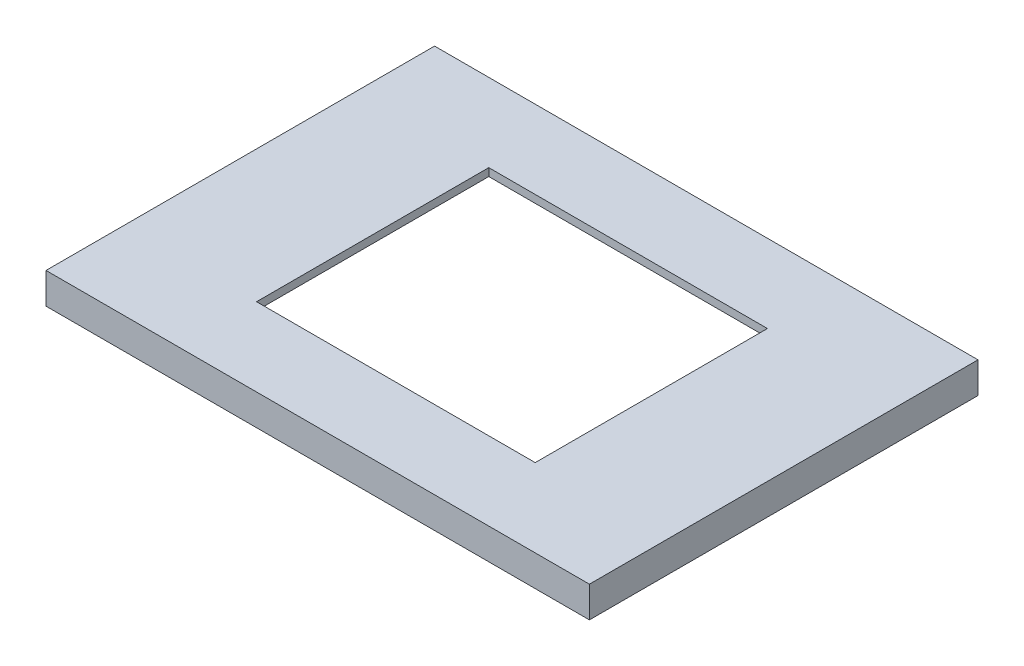
ISO-10303-21;
HEADER;
FILE_DESCRIPTION(('STEP AP214'),'2;1');
FILE_NAME('part.step','',(''),(''),'','','');
FILE_SCHEMA(('AUTOMOTIVE_DESIGN { 1 0 10303 214 1 1 1 1 }'));
ENDSEC;
DATA;
#1=APPLICATION_CONTEXT('core data for automotive mechanical design processes');
#2=APPLICATION_PROTOCOL_DEFINITION('international standard','automotive_design',2000,#1);
#3=PRODUCT_CONTEXT('',#1,'mechanical');
#4=PRODUCT('Part','Part','',(#3));
#5=PRODUCT_RELATED_PRODUCT_CATEGORY('part','',(#4));
#6=PRODUCT_DEFINITION_FORMATION('','',#4);
#7=PRODUCT_DEFINITION_CONTEXT('part definition',#1,'design');
#8=PRODUCT_DEFINITION('design','',#6,#7);
#9=PRODUCT_DEFINITION_SHAPE('','',#8);
#10=(LENGTH_UNIT() NAMED_UNIT(*) SI_UNIT(.MILLI.,.METRE.));
#11=(NAMED_UNIT(*) PLANE_ANGLE_UNIT() SI_UNIT($,.RADIAN.));
#12=(NAMED_UNIT(*) SI_UNIT($,.STERADIAN.) SOLID_ANGLE_UNIT());
#13=UNCERTAINTY_MEASURE_WITH_UNIT(LENGTH_MEASURE(1.E-05),#10,'distance_accuracy_value','');
#14=(GEOMETRIC_REPRESENTATION_CONTEXT(3) GLOBAL_UNCERTAINTY_ASSIGNED_CONTEXT((#13)) GLOBAL_UNIT_ASSIGNED_CONTEXT((#10,
#11,#12)) REPRESENTATION_CONTEXT('',''));
#15=CARTESIAN_POINT('',(0.,0.,0.));
#16=DIRECTION('',(0.,0.,1.));
#17=DIRECTION('',(1.,0.,0.));
#18=AXIS2_PLACEMENT_3D('',#15,#16,#17);
#19=CARTESIAN_POINT('',(-33.1,1.25,23.1));
#20=DIRECTION('',(1.,0.,0.));
#21=DIRECTION('',(0.,0.,-1.));
#22=AXIS2_PLACEMENT_3D('',#19,#20,#21);
#23=PLANE('',#22);
#24=DIRECTION('',(0.,-1.,0.));
#25=VECTOR('',#24,1.);
#26=CARTESIAN_POINT('',(-33.1,1.25,-23.1));
#27=LINE('',#26,#25);
#28=CARTESIAN_POINT('',(-33.1,-1.44160797830996,-23.1));
#29=VERTEX_POINT('',#28);
#30=CARTESIAN_POINT('',(-33.1,-1.75,-23.1));
#31=VERTEX_POINT('',#30);
#32=EDGE_CURVE('E197',#29,#31,#27,.T.);
#33=ORIENTED_EDGE('',*,*,#32,.F.);
#34=DIRECTION('',(0.,0.,1.));
#35=VECTOR('',#34,1.);
#36=CARTESIAN_POINT('',(-33.1,-1.44160797830996,23.1));
#37=LINE('',#36,#35);
#38=CARTESIAN_POINT('',(-33.1,-1.44160797830996,23.1));
#39=VERTEX_POINT('',#38);
#40=EDGE_CURVE('E374',#29,#39,#37,.T.);
#41=ORIENTED_EDGE('',*,*,#40,.T.);
#42=DIRECTION('',(0.,-1.,0.));
#43=VECTOR('',#42,1.);
#44=CARTESIAN_POINT('',(-33.1,1.25,23.1));
#45=LINE('',#44,#43);
#46=CARTESIAN_POINT('',(-33.1,-1.75,23.1));
#47=VERTEX_POINT('',#46);
#48=EDGE_CURVE('E214',#39,#47,#45,.T.);
#49=ORIENTED_EDGE('',*,*,#48,.T.);
#50=DIRECTION('',(0.,0.,-1.));
#51=VECTOR('',#50,1.);
#52=CARTESIAN_POINT('',(-33.1,-1.75,23.1));
#53=LINE('',#52,#51);
#54=EDGE_CURVE('E212',#47,#31,#53,.T.);
#55=ORIENTED_EDGE('',*,*,#54,.T.);
#56=EDGE_LOOP('',(#33,#41,#49,#55));
#57=FACE_BOUND('',#56,.T.);
#58=ADVANCED_FACE('F57',(#57),#23,.T.);
#59=CARTESIAN_POINT('',(33.1,1.25,23.1));
#60=DIRECTION('',(0.,0.,-1.));
#61=DIRECTION('',(-1.,0.,0.));
#62=AXIS2_PLACEMENT_3D('',#59,#60,#61);
#63=PLANE('',#62);
#64=ORIENTED_EDGE('',*,*,#48,.F.);
#65=DIRECTION('',(1.,0.,0.));
#66=VECTOR('',#65,1.);
#67=CARTESIAN_POINT('',(33.1,-1.44160797830996,23.1));
#68=LINE('',#67,#66);
#69=CARTESIAN_POINT('',(33.1,-1.44160797830996,23.1));
#70=VERTEX_POINT('',#69);
#71=EDGE_CURVE('E370',#39,#70,#68,.T.);
#72=ORIENTED_EDGE('',*,*,#71,.T.);
#73=DIRECTION('',(0.,-1.,0.));
#74=VECTOR('',#73,1.);
#75=CARTESIAN_POINT('',(33.1,1.25,23.1));
#76=LINE('',#75,#74);
#77=CARTESIAN_POINT('',(33.1,-1.75,23.1));
#78=VERTEX_POINT('',#77);
#79=EDGE_CURVE('E328',#70,#78,#76,.T.);
#80=ORIENTED_EDGE('',*,*,#79,.T.);
#81=DIRECTION('',(-1.,0.,0.));
#82=VECTOR('',#81,1.);
#83=CARTESIAN_POINT('',(-33.1,-1.75,23.1));
#84=LINE('',#83,#82);
#85=EDGE_CURVE('E227',#78,#47,#84,.T.);
#86=ORIENTED_EDGE('',*,*,#85,.T.);
#87=EDGE_LOOP('',(#64,#72,#80,#86));
#88=FACE_BOUND('',#87,.T.);
#89=ADVANCED_FACE('F435',(#88),#63,.T.);
#90=CARTESIAN_POINT('',(33.1,1.25,23.1));
#91=DIRECTION('',(-1.,0.,0.));
#92=DIRECTION('',(0.,0.,1.));
#93=AXIS2_PLACEMENT_3D('',#90,#91,#92);
#94=PLANE('',#93);
#95=ORIENTED_EDGE('',*,*,#79,.F.);
#96=DIRECTION('',(0.,0.,-1.));
#97=VECTOR('',#96,1.);
#98=CARTESIAN_POINT('',(33.1,-1.44160797830996,-23.1));
#99=LINE('',#98,#97);
#100=CARTESIAN_POINT('',(33.1,-1.44160797830996,-23.1));
#101=VERTEX_POINT('',#100);
#102=EDGE_CURVE('E12',#70,#101,#99,.T.);
#103=ORIENTED_EDGE('',*,*,#102,.T.);
#104=DIRECTION('',(0.,-1.,0.));
#105=VECTOR('',#104,1.);
#106=CARTESIAN_POINT('',(33.1,1.25,-23.1));
#107=LINE('',#106,#105);
#108=CARTESIAN_POINT('',(33.1,-1.75,-23.1));
#109=VERTEX_POINT('',#108);
#110=EDGE_CURVE('E324',#101,#109,#107,.T.);
#111=ORIENTED_EDGE('',*,*,#110,.T.);
#112=DIRECTION('',(0.,0.,1.));
#113=VECTOR('',#112,1.);
#114=CARTESIAN_POINT('',(33.1,-1.75,23.1));
#115=LINE('',#114,#113);
#116=EDGE_CURVE('E223',#109,#78,#115,.T.);
#117=ORIENTED_EDGE('',*,*,#116,.T.);
#118=EDGE_LOOP('',(#95,#103,#111,#117));
#119=FACE_BOUND('',#118,.T.);
#120=ADVANCED_FACE('F499',(#119),#94,.T.);
#121=CARTESIAN_POINT('',(33.1,1.25,-23.1));
#122=DIRECTION('',(0.,0.,1.));
#123=DIRECTION('',(1.,0.,0.));
#124=AXIS2_PLACEMENT_3D('',#121,#122,#123);
#125=PLANE('',#124);
#126=ORIENTED_EDGE('',*,*,#110,.F.);
#127=DIRECTION('',(-1.,0.,0.));
#128=VECTOR('',#127,1.);
#129=CARTESIAN_POINT('',(-33.1,-1.44160797830996,-23.1));
#130=LINE('',#129,#128);
#131=EDGE_CURVE('E204',#101,#29,#130,.T.);
#132=ORIENTED_EDGE('',*,*,#131,.T.);
#133=ORIENTED_EDGE('',*,*,#32,.T.);
#134=DIRECTION('',(1.,0.,0.));
#135=VECTOR('',#134,1.);
#136=CARTESIAN_POINT('',(-33.1,-1.75,-23.1));
#137=LINE('',#136,#135);
#138=EDGE_CURVE('E201',#31,#109,#137,.T.);
#139=ORIENTED_EDGE('',*,*,#138,.T.);
#140=EDGE_LOOP('',(#126,#132,#133,#139));
#141=FACE_BOUND('',#140,.T.);
#142=ADVANCED_FACE('F199',(#141),#125,.T.);
#143=CARTESIAN_POINT('',(35.1,1.25,25.1));
#144=DIRECTION('',(0.,0.,-1.));
#145=DIRECTION('',(-1.,0.,0.));
#146=AXIS2_PLACEMENT_3D('',#143,#144,#145);
#147=PLANE('',#146);
#148=DIRECTION('',(0.,-1.,0.));
#149=VECTOR('',#148,1.);
#150=CARTESIAN_POINT('',(-35.1,1.25,25.1));
#151=LINE('',#150,#149);
#152=CARTESIAN_POINT('',(-35.1,2.25,25.1));
#153=VERTEX_POINT('',#152);
#154=CARTESIAN_POINT('',(-35.1,-1.75,25.1));
#155=VERTEX_POINT('',#154);
#156=EDGE_CURVE('E337',#153,#155,#151,.T.);
#157=ORIENTED_EDGE('',*,*,#156,.T.);
#158=DIRECTION('',(-1.,0.,0.));
#159=VECTOR('',#158,1.);
#160=CARTESIAN_POINT('',(-35.1,-1.75,25.1));
#161=LINE('',#160,#159);
#162=CARTESIAN_POINT('',(35.1,-1.75,25.1));
#163=VERTEX_POINT('',#162);
#164=EDGE_CURVE('E245',#163,#155,#161,.T.);
#165=ORIENTED_EDGE('',*,*,#164,.F.);
#166=DIRECTION('',(0.,-1.,0.));
#167=VECTOR('',#166,1.);
#168=CARTESIAN_POINT('',(35.1,1.25,25.1));
#169=LINE('',#168,#167);
#170=CARTESIAN_POINT('',(35.1,2.25,25.1));
#171=VERTEX_POINT('',#170);
#172=EDGE_CURVE('E346',#171,#163,#169,.T.);
#173=ORIENTED_EDGE('',*,*,#172,.F.);
#174=DIRECTION('',(1.,0.,0.));
#175=VECTOR('',#174,1.);
#176=CARTESIAN_POINT('',(35.1,2.25,25.1));
#177=LINE('',#176,#175);
#178=EDGE_CURVE('E296',#153,#171,#177,.T.);
#179=ORIENTED_EDGE('',*,*,#178,.F.);
#180=EDGE_LOOP('',(#157,#165,#173,#179));
#181=FACE_BOUND('',#180,.T.);
#182=ADVANCED_FACE('F532',(#181),#147,.F.);
#183=CARTESIAN_POINT('',(35.1,1.25,25.1));
#184=DIRECTION('',(-1.,0.,0.));
#185=DIRECTION('',(0.,0.,1.));
#186=AXIS2_PLACEMENT_3D('',#183,#184,#185);
#187=PLANE('',#186);
#188=ORIENTED_EDGE('',*,*,#172,.T.);
#189=DIRECTION('',(0.,0.,1.));
#190=VECTOR('',#189,1.);
#191=CARTESIAN_POINT('',(35.1,-1.75,25.1));
#192=LINE('',#191,#190);
#193=CARTESIAN_POINT('',(35.1,-1.75,-25.1));
#194=VERTEX_POINT('',#193);
#195=EDGE_CURVE('E241',#194,#163,#192,.T.);
#196=ORIENTED_EDGE('',*,*,#195,.F.);
#197=DIRECTION('',(0.,-1.,0.));
#198=VECTOR('',#197,1.);
#199=CARTESIAN_POINT('',(35.1,1.25,-25.1));
#200=LINE('',#199,#198);
#201=CARTESIAN_POINT('',(35.1,2.25,-25.1));
#202=VERTEX_POINT('',#201);
#203=EDGE_CURVE('E343',#202,#194,#200,.T.);
#204=ORIENTED_EDGE('',*,*,#203,.F.);
#205=DIRECTION('',(0.,0.,-1.));
#206=VECTOR('',#205,1.);
#207=CARTESIAN_POINT('',(35.1,2.25,25.1));
#208=LINE('',#207,#206);
#209=EDGE_CURVE('E300',#171,#202,#208,.T.);
#210=ORIENTED_EDGE('',*,*,#209,.F.);
#211=EDGE_LOOP('',(#188,#196,#204,#210));
#212=FACE_BOUND('',#211,.T.);
#213=ADVANCED_FACE('F526',(#212),#187,.F.);
#214=CARTESIAN_POINT('',(35.1,1.25,-25.1));
#215=DIRECTION('',(0.,0.,1.));
#216=DIRECTION('',(1.,0.,0.));
#217=AXIS2_PLACEMENT_3D('',#214,#215,#216);
#218=PLANE('',#217);
#219=ORIENTED_EDGE('',*,*,#203,.T.);
#220=DIRECTION('',(1.,0.,0.));
#221=VECTOR('',#220,1.);
#222=CARTESIAN_POINT('',(-35.1,-1.75,-25.1));
#223=LINE('',#222,#221);
#224=CARTESIAN_POINT('',(-35.1,-1.75,-25.1));
#225=VERTEX_POINT('',#224);
#226=EDGE_CURVE('E237',#225,#194,#223,.T.);
#227=ORIENTED_EDGE('',*,*,#226,.F.);
#228=DIRECTION('',(0.,-1.,0.));
#229=VECTOR('',#228,1.);
#230=CARTESIAN_POINT('',(-35.1,1.25,-25.1));
#231=LINE('',#230,#229);
#232=CARTESIAN_POINT('',(-35.1,2.25,-25.1));
#233=VERTEX_POINT('',#232);
#234=EDGE_CURVE('E340',#233,#225,#231,.T.);
#235=ORIENTED_EDGE('',*,*,#234,.F.);
#236=DIRECTION('',(-1.,0.,0.));
#237=VECTOR('',#236,1.);
#238=CARTESIAN_POINT('',(35.1,2.25,-25.1));
#239=LINE('',#238,#237);
#240=EDGE_CURVE('E304',#202,#233,#239,.T.);
#241=ORIENTED_EDGE('',*,*,#240,.F.);
#242=EDGE_LOOP('',(#219,#227,#235,#241));
#243=FACE_BOUND('',#242,.T.);
#244=ADVANCED_FACE('F521',(#243),#218,.F.);
#245=CARTESIAN_POINT('',(-35.1,1.25,25.1));
#246=DIRECTION('',(1.,0.,0.));
#247=DIRECTION('',(0.,0.,-1.));
#248=AXIS2_PLACEMENT_3D('',#245,#246,#247);
#249=PLANE('',#248);
#250=ORIENTED_EDGE('',*,*,#234,.T.);
#251=DIRECTION('',(0.,0.,-1.));
#252=VECTOR('',#251,1.);
#253=CARTESIAN_POINT('',(-35.1,-1.75,25.1));
#254=LINE('',#253,#252);
#255=EDGE_CURVE('E233',#155,#225,#254,.T.);
#256=ORIENTED_EDGE('',*,*,#255,.F.);
#257=ORIENTED_EDGE('',*,*,#156,.F.);
#258=DIRECTION('',(0.,0.,1.));
#259=VECTOR('',#258,1.);
#260=CARTESIAN_POINT('',(-35.1,2.25,25.1));
#261=LINE('',#260,#259);
#262=EDGE_CURVE('E292',#233,#153,#261,.T.);
#263=ORIENTED_EDGE('',*,*,#262,.F.);
#264=EDGE_LOOP('',(#250,#256,#257,#263));
#265=FACE_BOUND('',#264,.T.);
#266=ADVANCED_FACE('F516',(#265),#249,.F.);
#267=CARTESIAN_POINT('',(-33.1,1.25,23.1));
#268=VERTEX_POINT('',#267);
#269=CARTESIAN_POINT('',(-33.1,-0.258392021690037,23.1));
#270=VERTEX_POINT('',#269);
#271=EDGE_CURVE('E333',#268,#270,#45,.T.);
#272=ORIENTED_EDGE('',*,*,#271,.T.);
#273=DIRECTION('',(0.,0.,1.));
#274=VECTOR('',#273,1.);
#275=CARTESIAN_POINT('',(-33.1,-0.258392021690041,-23.1));
#276=LINE('',#275,#274);
#277=CARTESIAN_POINT('',(-33.1,-0.258392021690037,-23.1));
#278=VERTEX_POINT('',#277);
#279=EDGE_CURVE('E356',#270,#278,#276,.F.);
#280=ORIENTED_EDGE('',*,*,#279,.T.);
#281=CARTESIAN_POINT('',(-33.1,1.25,-23.1));
#282=VERTEX_POINT('',#281);
#283=EDGE_CURVE('E208',#282,#278,#27,.T.);
#284=ORIENTED_EDGE('',*,*,#283,.F.);
#285=DIRECTION('',(0.,0.,1.));
#286=VECTOR('',#285,1.);
#287=CARTESIAN_POINT('',(-33.1,1.25,23.1));
#288=LINE('',#287,#286);
#289=EDGE_CURVE('E308',#282,#268,#288,.T.);
#290=ORIENTED_EDGE('',*,*,#289,.T.);
#291=EDGE_LOOP('',(#272,#280,#284,#290));
#292=FACE_BOUND('',#291,.T.);
#293=ADVANCED_FACE('F489',(#292),#23,.T.);
#294=CARTESIAN_POINT('',(33.1,1.25,23.1));
#295=VERTEX_POINT('',#294);
#296=CARTESIAN_POINT('',(33.1,-0.258392021690038,23.1));
#297=VERTEX_POINT('',#296);
#298=EDGE_CURVE('E329',#295,#297,#76,.T.);
#299=ORIENTED_EDGE('',*,*,#298,.T.);
#300=DIRECTION('',(1.,0.,0.));
#301=VECTOR('',#300,1.);
#302=CARTESIAN_POINT('',(-33.1,-0.258392021690037,23.1));
#303=LINE('',#302,#301);
#304=EDGE_CURVE('E367',#297,#270,#303,.F.);
#305=ORIENTED_EDGE('',*,*,#304,.T.);
#306=ORIENTED_EDGE('',*,*,#271,.F.);
#307=DIRECTION('',(1.,0.,0.));
#308=VECTOR('',#307,1.);
#309=CARTESIAN_POINT('',(33.1,1.25,23.1));
#310=LINE('',#309,#308);
#311=EDGE_CURVE('E312',#268,#295,#310,.T.);
#312=ORIENTED_EDGE('',*,*,#311,.T.);
#313=EDGE_LOOP('',(#299,#305,#306,#312));
#314=FACE_BOUND('',#313,.T.);
#315=ADVANCED_FACE('F486',(#314),#63,.T.);
#316=CARTESIAN_POINT('',(33.1,1.25,-23.1));
#317=VERTEX_POINT('',#316);
#318=CARTESIAN_POINT('',(33.1,-0.258392021690037,-23.1));
#319=VERTEX_POINT('',#318);
#320=EDGE_CURVE('E325',#317,#319,#107,.T.);
#321=ORIENTED_EDGE('',*,*,#320,.T.);
#322=DIRECTION('',(0.,0.,-1.));
#323=VECTOR('',#322,1.);
#324=CARTESIAN_POINT('',(33.1,-0.258392021690038,23.1));
#325=LINE('',#324,#323);
#326=EDGE_CURVE('E391',#319,#297,#325,.F.);
#327=ORIENTED_EDGE('',*,*,#326,.T.);
#328=ORIENTED_EDGE('',*,*,#298,.F.);
#329=DIRECTION('',(0.,0.,-1.));
#330=VECTOR('',#329,1.);
#331=CARTESIAN_POINT('',(33.1,1.25,23.1));
#332=LINE('',#331,#330);
#333=EDGE_CURVE('E316',#295,#317,#332,.T.);
#334=ORIENTED_EDGE('',*,*,#333,.T.);
#335=EDGE_LOOP('',(#321,#327,#328,#334));
#336=FACE_BOUND('',#335,.T.);
#337=ADVANCED_FACE('F496',(#336),#94,.T.);
#338=ORIENTED_EDGE('',*,*,#283,.T.);
#339=DIRECTION('',(-1.,0.,0.));
#340=VECTOR('',#339,1.);
#341=CARTESIAN_POINT('',(33.1,-0.258392021690037,-23.1));
#342=LINE('',#341,#340);
#343=EDGE_CURVE('E67',#278,#319,#342,.F.);
#344=ORIENTED_EDGE('',*,*,#343,.T.);
#345=ORIENTED_EDGE('',*,*,#320,.F.);
#346=DIRECTION('',(-1.,0.,0.));
#347=VECTOR('',#346,1.);
#348=CARTESIAN_POINT('',(33.1,1.25,-23.1));
#349=LINE('',#348,#347);
#350=EDGE_CURVE('E209',#317,#282,#349,.T.);
#351=ORIENTED_EDGE('',*,*,#350,.T.);
#352=EDGE_LOOP('',(#338,#344,#345,#351));
#353=FACE_BOUND('',#352,.T.);
#354=ADVANCED_FACE('F494',(#353),#125,.T.);
#355=CARTESIAN_POINT('',(0.,2.25,0.));
#356=DIRECTION('',(0.,1.,0.));
#357=DIRECTION('',(0.,0.,1.));
#358=AXIS2_PLACEMENT_3D('',#355,#356,#357);
#359=PLANE('',#358);
#360=ORIENTED_EDGE('',*,*,#262,.T.);
#361=ORIENTED_EDGE('',*,*,#178,.T.);
#362=ORIENTED_EDGE('',*,*,#209,.T.);
#363=ORIENTED_EDGE('',*,*,#240,.T.);
#364=EDGE_LOOP('',(#360,#361,#362,#363));
#365=FACE_BOUND('',#364,.T.);
#366=DIRECTION('',(-1.,0.,0.));
#367=VECTOR('',#366,1.);
#368=CARTESIAN_POINT('',(-18.,2.25,-15.));
#369=LINE('',#368,#367);
#370=CARTESIAN_POINT('',(18.,2.25,-15.));
#371=VERTEX_POINT('',#370);
#372=CARTESIAN_POINT('',(-18.,2.25,-15.));
#373=VERTEX_POINT('',#372);
#374=EDGE_CURVE('E253',#371,#373,#369,.T.);
#375=ORIENTED_EDGE('',*,*,#374,.F.);
#376=DIRECTION('',(0.,0.,-1.));
#377=VECTOR('',#376,1.);
#378=CARTESIAN_POINT('',(18.,2.25,15.));
#379=LINE('',#378,#377);
#380=CARTESIAN_POINT('',(18.,2.25,15.));
#381=VERTEX_POINT('',#380);
#382=EDGE_CURVE('E250',#381,#371,#379,.T.);
#383=ORIENTED_EDGE('',*,*,#382,.F.);
#384=DIRECTION('',(1.,0.,0.));
#385=VECTOR('',#384,1.);
#386=CARTESIAN_POINT('',(-18.,2.25,15.));
#387=LINE('',#386,#385);
#388=CARTESIAN_POINT('',(-18.,2.25,15.));
#389=VERTEX_POINT('',#388);
#390=EDGE_CURVE('E261',#389,#381,#387,.T.);
#391=ORIENTED_EDGE('',*,*,#390,.F.);
#392=DIRECTION('',(0.,0.,1.));
#393=VECTOR('',#392,1.);
#394=CARTESIAN_POINT('',(-18.,2.25,15.));
#395=LINE('',#394,#393);
#396=EDGE_CURVE('E257',#373,#389,#395,.T.);
#397=ORIENTED_EDGE('',*,*,#396,.F.);
#398=EDGE_LOOP('',(#375,#383,#391,#397));
#399=FACE_BOUND('',#398,.T.);
#400=ADVANCED_FACE('F504',(#365,#399),#359,.T.);
#401=CARTESIAN_POINT('',(0.,1.25,0.));
#402=DIRECTION('',(0.,1.,0.));
#403=DIRECTION('',(0.,0.,1.));
#404=AXIS2_PLACEMENT_3D('',#401,#402,#403);
#405=PLANE('',#404);
#406=ORIENTED_EDGE('',*,*,#289,.F.);
#407=ORIENTED_EDGE('',*,*,#350,.F.);
#408=ORIENTED_EDGE('',*,*,#333,.F.);
#409=ORIENTED_EDGE('',*,*,#311,.F.);
#410=EDGE_LOOP('',(#406,#407,#408,#409));
#411=FACE_BOUND('',#410,.T.);
#412=DIRECTION('',(0.,0.,-1.));
#413=VECTOR('',#412,1.);
#414=CARTESIAN_POINT('',(18.,1.25,15.));
#415=LINE('',#414,#413);
#416=CARTESIAN_POINT('',(18.,1.25,15.));
#417=VERTEX_POINT('',#416);
#418=CARTESIAN_POINT('',(18.,1.25,-15.));
#419=VERTEX_POINT('',#418);
#420=EDGE_CURVE('E249',#417,#419,#415,.T.);
#421=ORIENTED_EDGE('',*,*,#420,.T.);
#422=DIRECTION('',(-1.,0.,0.));
#423=VECTOR('',#422,1.);
#424=CARTESIAN_POINT('',(-18.,1.25,-15.));
#425=LINE('',#424,#423);
#426=CARTESIAN_POINT('',(-18.,1.25,-15.));
#427=VERTEX_POINT('',#426);
#428=EDGE_CURVE('E268',#419,#427,#425,.T.);
#429=ORIENTED_EDGE('',*,*,#428,.T.);
#430=DIRECTION('',(0.,0.,1.));
#431=VECTOR('',#430,1.);
#432=CARTESIAN_POINT('',(-18.,1.25,15.));
#433=LINE('',#432,#431);
#434=CARTESIAN_POINT('',(-18.,1.25,15.));
#435=VERTEX_POINT('',#434);
#436=EDGE_CURVE('E272',#427,#435,#433,.T.);
#437=ORIENTED_EDGE('',*,*,#436,.T.);
#438=DIRECTION('',(1.,0.,0.));
#439=VECTOR('',#438,1.);
#440=CARTESIAN_POINT('',(-18.,1.25,15.));
#441=LINE('',#440,#439);
#442=EDGE_CURVE('E254',#435,#417,#441,.T.);
#443=ORIENTED_EDGE('',*,*,#442,.T.);
#444=EDGE_LOOP('',(#421,#429,#437,#443));
#445=FACE_BOUND('',#444,.T.);
#446=ADVANCED_FACE('F492',(#411,#445),#405,.F.);
#447=CARTESIAN_POINT('',(18.,2.25,15.));
#448=DIRECTION('',(-1.,0.,0.));
#449=DIRECTION('',(0.,0.,1.));
#450=AXIS2_PLACEMENT_3D('',#447,#448,#449);
#451=PLANE('',#450);
#452=ORIENTED_EDGE('',*,*,#420,.F.);
#453=DIRECTION('',(0.,-1.,0.));
#454=VECTOR('',#453,1.);
#455=CARTESIAN_POINT('',(18.,2.25,15.));
#456=LINE('',#455,#454);
#457=EDGE_CURVE('E264',#381,#417,#456,.T.);
#458=ORIENTED_EDGE('',*,*,#457,.F.);
#459=ORIENTED_EDGE('',*,*,#382,.T.);
#460=DIRECTION('',(0.,-1.,0.));
#461=VECTOR('',#460,1.);
#462=CARTESIAN_POINT('',(18.,2.25,-15.));
#463=LINE('',#462,#461);
#464=EDGE_CURVE('E288',#371,#419,#463,.T.);
#465=ORIENTED_EDGE('',*,*,#464,.T.);
#466=EDGE_LOOP('',(#452,#458,#459,#465));
#467=FACE_BOUND('',#466,.T.);
#468=ADVANCED_FACE('F690',(#467),#451,.T.);
#469=CARTESIAN_POINT('',(-18.,2.25,-15.));
#470=DIRECTION('',(0.,0.,1.));
#471=DIRECTION('',(1.,0.,0.));
#472=AXIS2_PLACEMENT_3D('',#469,#470,#471);
#473=PLANE('',#472);
#474=ORIENTED_EDGE('',*,*,#428,.F.);
#475=ORIENTED_EDGE('',*,*,#464,.F.);
#476=ORIENTED_EDGE('',*,*,#374,.T.);
#477=DIRECTION('',(0.,-1.,0.));
#478=VECTOR('',#477,1.);
#479=CARTESIAN_POINT('',(-18.,2.25,-15.));
#480=LINE('',#479,#478);
#481=EDGE_CURVE('E285',#373,#427,#480,.T.);
#482=ORIENTED_EDGE('',*,*,#481,.T.);
#483=EDGE_LOOP('',(#474,#475,#476,#482));
#484=FACE_BOUND('',#483,.T.);
#485=ADVANCED_FACE('F696',(#484),#473,.T.);
#486=CARTESIAN_POINT('',(-18.,2.25,15.));
#487=DIRECTION('',(1.,0.,0.));
#488=DIRECTION('',(0.,0.,-1.));
#489=AXIS2_PLACEMENT_3D('',#486,#487,#488);
#490=PLANE('',#489);
#491=ORIENTED_EDGE('',*,*,#436,.F.);
#492=ORIENTED_EDGE('',*,*,#481,.F.);
#493=ORIENTED_EDGE('',*,*,#396,.T.);
#494=DIRECTION('',(0.,-1.,0.));
#495=VECTOR('',#494,1.);
#496=CARTESIAN_POINT('',(-18.,2.25,15.));
#497=LINE('',#496,#495);
#498=EDGE_CURVE('E282',#389,#435,#497,.T.);
#499=ORIENTED_EDGE('',*,*,#498,.T.);
#500=EDGE_LOOP('',(#491,#492,#493,#499));
#501=FACE_BOUND('',#500,.T.);
#502=ADVANCED_FACE('F700',(#501),#490,.T.);
#503=CARTESIAN_POINT('',(-18.,2.25,15.));
#504=DIRECTION('',(0.,0.,-1.));
#505=DIRECTION('',(-1.,0.,0.));
#506=AXIS2_PLACEMENT_3D('',#503,#504,#505);
#507=PLANE('',#506);
#508=ORIENTED_EDGE('',*,*,#442,.F.);
#509=ORIENTED_EDGE('',*,*,#498,.F.);
#510=ORIENTED_EDGE('',*,*,#390,.T.);
#511=ORIENTED_EDGE('',*,*,#457,.T.);
#512=EDGE_LOOP('',(#508,#509,#510,#511));
#513=FACE_BOUND('',#512,.T.);
#514=ADVANCED_FACE('F624',(#513),#507,.T.);
#515=CARTESIAN_POINT('',(0.,-1.75,0.));
#516=DIRECTION('',(0.,-1.,0.));
#517=DIRECTION('',(0.,0.,-1.));
#518=AXIS2_PLACEMENT_3D('',#515,#516,#517);
#519=PLANE('',#518);
#520=ORIENTED_EDGE('',*,*,#255,.T.);
#521=ORIENTED_EDGE('',*,*,#226,.T.);
#522=ORIENTED_EDGE('',*,*,#195,.T.);
#523=ORIENTED_EDGE('',*,*,#164,.T.);
#524=EDGE_LOOP('',(#520,#521,#522,#523));
#525=FACE_BOUND('',#524,.T.);
#526=ORIENTED_EDGE('',*,*,#138,.F.);
#527=ORIENTED_EDGE('',*,*,#54,.F.);
#528=ORIENTED_EDGE('',*,*,#85,.F.);
#529=ORIENTED_EDGE('',*,*,#116,.F.);
#530=EDGE_LOOP('',(#526,#527,#528,#529));
#531=FACE_BOUND('',#530,.T.);
#532=ADVANCED_FACE('F221',(#525,#531),#519,.T.);
#533=CARTESIAN_POINT('',(33.75,-0.85,23.1));
#534=DIRECTION('',(-1.,0.,0.));
#535=DIRECTION('',(0.,0.,1.));
#536=AXIS2_PLACEMENT_3D('',#533,#534,#535);
#537=CYLINDRICAL_SURFACE('',#536,0.5);
#538=CARTESIAN_POINT('',(-33.1,-0.85,23.1));
#539=DIRECTION('',(-0.707106781186548,0.,-0.707106781186548));
#540=DIRECTION('',(0.707106781186548,0.,-0.707106781186548));
#541=AXIS2_PLACEMENT_3D('',#538,#539,#540);
#542=ELLIPSE('',#541,0.707106781186548,0.5);
#543=CARTESIAN_POINT('',(-33.1833333333333,-0.356993351408365,23.1833333333333));
#544=VERTEX_POINT('',#543);
#545=CARTESIAN_POINT('',(-33.1833333333333,-1.34300664859163,23.1833333333333));
#546=VERTEX_POINT('',#545);
#547=EDGE_CURVE('E410',#544,#546,#542,.F.);
#548=ORIENTED_EDGE('',*,*,#547,.F.);
#549=DIRECTION('',(-1.,0.,0.));
#550=VECTOR('',#549,1.);
#551=CARTESIAN_POINT('',(33.75,-0.356993351408365,23.1833333333333));
#552=LINE('',#551,#550);
#553=CARTESIAN_POINT('',(33.1833333333333,-0.356993351408366,23.1833333333333));
#554=VERTEX_POINT('',#553);
#555=EDGE_CURVE('E364',#544,#554,#552,.F.);
#556=ORIENTED_EDGE('',*,*,#555,.T.);
#557=CARTESIAN_POINT('',(33.1,-0.85,23.1));
#558=DIRECTION('',(-0.707106781186548,0.,0.707106781186547));
#559=DIRECTION('',(0.707106781186547,0.,0.707106781186548));
#560=AXIS2_PLACEMENT_3D('',#557,#558,#559);
#561=ELLIPSE('',#560,0.707106781186548,0.5);
#562=CARTESIAN_POINT('',(33.1833333333333,-1.34300664859163,23.1833333333333));
#563=VERTEX_POINT('',#562);
#564=EDGE_CURVE('E446',#554,#563,#561,.F.);
#565=ORIENTED_EDGE('',*,*,#564,.T.);
#566=DIRECTION('',(-1.,0.,0.));
#567=VECTOR('',#566,1.);
#568=CARTESIAN_POINT('',(33.75,-1.34300664859164,23.1833333333333));
#569=LINE('',#568,#567);
#570=EDGE_CURVE('E360',#563,#546,#569,.T.);
#571=ORIENTED_EDGE('',*,*,#570,.T.);
#572=EDGE_LOOP('',(#548,#556,#565,#571));
#573=FACE_BOUND('',#572,.T.);
#574=ADVANCED_FACE('F444',(#573),#537,.F.);
#575=CARTESIAN_POINT('',(-33.1,-0.85,23.75));
#576=DIRECTION('',(0.,0.,-1.));
#577=DIRECTION('',(-1.,0.,0.));
#578=AXIS2_PLACEMENT_3D('',#575,#576,#577);
#579=CYLINDRICAL_SURFACE('',#578,0.5);
#580=CARTESIAN_POINT('',(-33.1,-0.85,-23.1));
#581=DIRECTION('',(0.707106781186548,0.,-0.707106781186548));
#582=DIRECTION('',(0.707106781186548,0.,0.707106781186548));
#583=AXIS2_PLACEMENT_3D('',#580,#581,#582);
#584=ELLIPSE('',#583,0.707106781186548,0.5);
#585=CARTESIAN_POINT('',(-33.1833333333333,-0.356993351408364,-23.1833333333333));
#586=VERTEX_POINT('',#585);
#587=CARTESIAN_POINT('',(-33.1833333333333,-1.34300664859164,-23.1833333333333));
#588=VERTEX_POINT('',#587);
#589=EDGE_CURVE('E454',#586,#588,#584,.F.);
#590=ORIENTED_EDGE('',*,*,#589,.F.);
#591=DIRECTION('',(0.,0.,-1.));
#592=VECTOR('',#591,1.);
#593=CARTESIAN_POINT('',(-33.1833333333333,-0.356993351408367,23.75));
#594=LINE('',#593,#592);
#595=EDGE_CURVE('E352',#586,#544,#594,.F.);
#596=ORIENTED_EDGE('',*,*,#595,.T.);
#597=ORIENTED_EDGE('',*,*,#547,.T.);
#598=DIRECTION('',(0.,0.,-1.));
#599=VECTOR('',#598,1.);
#600=CARTESIAN_POINT('',(-33.1833333333333,-1.34300664859163,23.75));
#601=LINE('',#600,#599);
#602=EDGE_CURVE('E349',#546,#588,#601,.T.);
#603=ORIENTED_EDGE('',*,*,#602,.T.);
#604=EDGE_LOOP('',(#590,#596,#597,#603));
#605=FACE_BOUND('',#604,.T.);
#606=ADVANCED_FACE('F449',(#605),#579,.F.);
#607=CARTESIAN_POINT('',(33.1,-0.85,-23.75));
#608=DIRECTION('',(0.,0.,1.));
#609=DIRECTION('',(1.,0.,0.));
#610=AXIS2_PLACEMENT_3D('',#607,#608,#609);
#611=CYLINDRICAL_SURFACE('',#610,0.5);
#612=ORIENTED_EDGE('',*,*,#564,.F.);
#613=DIRECTION('',(0.,0.,1.));
#614=VECTOR('',#613,1.);
#615=CARTESIAN_POINT('',(33.1833333333333,-0.356993351408366,-23.75));
#616=LINE('',#615,#614);
#617=CARTESIAN_POINT('',(33.1833333333333,-0.356993351408364,-23.1833333333333));
#618=VERTEX_POINT('',#617);
#619=EDGE_CURVE('E388',#554,#618,#616,.F.);
#620=ORIENTED_EDGE('',*,*,#619,.T.);
#621=CARTESIAN_POINT('',(33.1,-0.85,-23.1));
#622=DIRECTION('',(0.707106781186547,0.,0.707106781186548));
#623=DIRECTION('',(0.707106781186548,0.,-0.707106781186547));
#624=AXIS2_PLACEMENT_3D('',#621,#622,#623);
#625=ELLIPSE('',#624,0.707106781186548,0.5);
#626=CARTESIAN_POINT('',(33.1833333333333,-1.34300664859163,-23.1833333333334));
#627=VERTEX_POINT('',#626);
#628=EDGE_CURVE('E219',#618,#627,#625,.F.);
#629=ORIENTED_EDGE('',*,*,#628,.T.);
#630=DIRECTION('',(0.,0.,1.));
#631=VECTOR('',#630,1.);
#632=CARTESIAN_POINT('',(33.1833333333333,-1.34300664859163,-23.75));
#633=LINE('',#632,#631);
#634=EDGE_CURVE('E385',#627,#563,#633,.T.);
#635=ORIENTED_EDGE('',*,*,#634,.T.);
#636=EDGE_LOOP('',(#612,#620,#629,#635));
#637=FACE_BOUND('',#636,.T.);
#638=ADVANCED_FACE('F463',(#637),#611,.F.);
#639=CARTESIAN_POINT('',(-33.75,-0.85,-23.1));
#640=DIRECTION('',(1.,0.,0.));
#641=DIRECTION('',(0.,0.,-1.));
#642=AXIS2_PLACEMENT_3D('',#639,#640,#641);
#643=CYLINDRICAL_SURFACE('',#642,0.5);
#644=ORIENTED_EDGE('',*,*,#589,.T.);
#645=DIRECTION('',(1.,0.,0.));
#646=VECTOR('',#645,1.);
#647=CARTESIAN_POINT('',(-33.75,-1.34300664859164,-23.1833333333333));
#648=LINE('',#647,#646);
#649=EDGE_CURVE('E380',#588,#627,#648,.T.);
#650=ORIENTED_EDGE('',*,*,#649,.T.);
#651=ORIENTED_EDGE('',*,*,#628,.F.);
#652=DIRECTION('',(1.,0.,0.));
#653=VECTOR('',#652,1.);
#654=CARTESIAN_POINT('',(-33.75,-0.356993351408364,-23.1833333333333));
#655=LINE('',#654,#653);
#656=EDGE_CURVE('E377',#618,#586,#655,.F.);
#657=ORIENTED_EDGE('',*,*,#656,.T.);
#658=EDGE_LOOP('',(#644,#650,#651,#657));
#659=FACE_BOUND('',#658,.T.);
#660=ADVANCED_FACE('F467',(#659),#643,.F.);
#661=CARTESIAN_POINT('',(33.2,-0.258392021690038,-23.75));
#662=DIRECTION('',(0.,0.,1.));
#663=DIRECTION('',(1.,0.,0.));
#664=AXIS2_PLACEMENT_3D('',#661,#662,#663);
#665=CYLINDRICAL_SURFACE('',#664,0.1);
#666=CARTESIAN_POINT('',(33.2,-0.258392021690038,23.2));
#667=DIRECTION('',(-0.707106781186547,0.,0.707106781186547));
#668=DIRECTION('',(-0.707106781186547,0.,-0.707106781186548));
#669=AXIS2_PLACEMENT_3D('',#666,#667,#668);
#670=ELLIPSE('',#669,0.14142135623731,0.1);
#671=EDGE_CURVE('E402',#297,#554,#670,.T.);
#672=ORIENTED_EDGE('',*,*,#671,.F.);
#673=ORIENTED_EDGE('',*,*,#326,.F.);
#674=CARTESIAN_POINT('',(33.2,-0.258392021690038,-23.2));
#675=DIRECTION('',(0.707106781186547,0.,0.707106781186548));
#676=DIRECTION('',(-0.707106781186547,0.,0.707106781186547));
#677=AXIS2_PLACEMENT_3D('',#674,#675,#676);
#678=ELLIPSE('',#677,0.14142135623731,0.1);
#679=EDGE_CURVE('E406',#618,#319,#678,.F.);
#680=ORIENTED_EDGE('',*,*,#679,.F.);
#681=ORIENTED_EDGE('',*,*,#619,.F.);
#682=EDGE_LOOP('',(#672,#673,#680,#681));
#683=FACE_BOUND('',#682,.T.);
#684=ADVANCED_FACE('F472',(#683),#665,.T.);
#685=CARTESIAN_POINT('',(-33.75,-0.258392021690037,-23.2));
#686=DIRECTION('',(1.,0.,0.));
#687=DIRECTION('',(0.,0.,-1.));
#688=AXIS2_PLACEMENT_3D('',#685,#686,#687);
#689=CYLINDRICAL_SURFACE('',#688,0.1);
#690=ORIENTED_EDGE('',*,*,#679,.T.);
#691=ORIENTED_EDGE('',*,*,#343,.F.);
#692=CARTESIAN_POINT('',(-33.2,-0.258392021690039,-23.2));
#693=DIRECTION('',(0.707106781186547,0.,-0.707106781186548));
#694=DIRECTION('',(-0.707106781186547,0.,-0.707106781186548));
#695=AXIS2_PLACEMENT_3D('',#692,#693,#694);
#696=ELLIPSE('',#695,0.14142135623731,0.1);
#697=EDGE_CURVE('E399',#586,#278,#696,.F.);
#698=ORIENTED_EDGE('',*,*,#697,.F.);
#699=ORIENTED_EDGE('',*,*,#656,.F.);
#700=EDGE_LOOP('',(#690,#691,#698,#699));
#701=FACE_BOUND('',#700,.T.);
#702=ADVANCED_FACE('F475',(#701),#689,.T.);
#703=CARTESIAN_POINT('',(33.75,-0.258392021690037,23.2));
#704=DIRECTION('',(-1.,0.,0.));
#705=DIRECTION('',(0.,0.,1.));
#706=AXIS2_PLACEMENT_3D('',#703,#704,#705);
#707=CYLINDRICAL_SURFACE('',#706,0.1);
#708=ORIENTED_EDGE('',*,*,#671,.T.);
#709=ORIENTED_EDGE('',*,*,#555,.F.);
#710=CARTESIAN_POINT('',(-33.2,-0.258392021690039,23.2));
#711=DIRECTION('',(-0.707106781186547,0.,-0.707106781186548));
#712=DIRECTION('',(0.707106781186547,0.,-0.707106781186548));
#713=AXIS2_PLACEMENT_3D('',#710,#711,#712);
#714=ELLIPSE('',#713,0.14142135623731,0.1);
#715=EDGE_CURVE('E396',#270,#544,#714,.T.);
#716=ORIENTED_EDGE('',*,*,#715,.F.);
#717=ORIENTED_EDGE('',*,*,#304,.F.);
#718=EDGE_LOOP('',(#708,#709,#716,#717));
#719=FACE_BOUND('',#718,.T.);
#720=ADVANCED_FACE('F483',(#719),#707,.T.);
#721=CARTESIAN_POINT('',(-33.2,-0.258392021690041,23.75));
#722=DIRECTION('',(0.,0.,-1.));
#723=DIRECTION('',(-1.,0.,0.));
#724=AXIS2_PLACEMENT_3D('',#721,#722,#723);
#725=CYLINDRICAL_SURFACE('',#724,0.1);
#726=ORIENTED_EDGE('',*,*,#697,.T.);
#727=ORIENTED_EDGE('',*,*,#279,.F.);
#728=ORIENTED_EDGE('',*,*,#715,.T.);
#729=ORIENTED_EDGE('',*,*,#595,.F.);
#730=EDGE_LOOP('',(#726,#727,#728,#729));
#731=FACE_BOUND('',#730,.T.);
#732=ADVANCED_FACE('F478',(#731),#725,.T.);
#733=CARTESIAN_POINT('',(-33.75,-1.44160797830996,-23.2));
#734=DIRECTION('',(1.,0.,0.));
#735=DIRECTION('',(0.,0.,-1.));
#736=AXIS2_PLACEMENT_3D('',#733,#734,#735);
#737=CYLINDRICAL_SURFACE('',#736,0.1);
#738=CARTESIAN_POINT('',(-33.2,-1.44160797830996,-23.2));
#739=DIRECTION('',(0.707106781186547,0.,-0.707106781186548));
#740=DIRECTION('',(-0.707106781186547,0.,-0.707106781186548));
#741=AXIS2_PLACEMENT_3D('',#738,#739,#740);
#742=ELLIPSE('',#741,0.14142135623731,0.1);
#743=EDGE_CURVE('E416',#29,#588,#742,.F.);
#744=ORIENTED_EDGE('',*,*,#743,.F.);
#745=ORIENTED_EDGE('',*,*,#131,.F.);
#746=CARTESIAN_POINT('',(33.2,-1.44160797830996,-23.2));
#747=DIRECTION('',(0.707106781186547,0.,0.707106781186548));
#748=DIRECTION('',(0.707106781186547,0.,-0.707106781186547));
#749=AXIS2_PLACEMENT_3D('',#746,#747,#748);
#750=ELLIPSE('',#749,0.14142135623731,0.1);
#751=EDGE_CURVE('E61',#627,#101,#750,.T.);
#752=ORIENTED_EDGE('',*,*,#751,.F.);
#753=ORIENTED_EDGE('',*,*,#649,.F.);
#754=EDGE_LOOP('',(#744,#745,#752,#753));
#755=FACE_BOUND('',#754,.T.);
#756=ADVANCED_FACE('F59',(#755),#737,.T.);
#757=CARTESIAN_POINT('',(33.2,-1.44160797830996,-23.75));
#758=DIRECTION('',(0.,0.,1.));
#759=DIRECTION('',(1.,0.,0.));
#760=AXIS2_PLACEMENT_3D('',#757,#758,#759);
#761=CYLINDRICAL_SURFACE('',#760,0.1);
#762=ORIENTED_EDGE('',*,*,#751,.T.);
#763=ORIENTED_EDGE('',*,*,#102,.F.);
#764=CARTESIAN_POINT('',(33.2,-1.44160797830996,23.2));
#765=DIRECTION('',(-0.707106781186547,0.,0.707106781186547));
#766=DIRECTION('',(-0.707106781186547,0.,-0.707106781186548));
#767=AXIS2_PLACEMENT_3D('',#764,#765,#766);
#768=ELLIPSE('',#767,0.14142135623731,0.1);
#769=EDGE_CURVE('E414',#563,#70,#768,.T.);
#770=ORIENTED_EDGE('',*,*,#769,.F.);
#771=ORIENTED_EDGE('',*,*,#634,.F.);
#772=EDGE_LOOP('',(#762,#763,#770,#771));
#773=FACE_BOUND('',#772,.T.);
#774=ADVANCED_FACE('F427',(#773),#761,.T.);
#775=CARTESIAN_POINT('',(-33.2,-1.44160797830996,23.75));
#776=DIRECTION('',(0.,0.,-1.));
#777=DIRECTION('',(-1.,0.,0.));
#778=AXIS2_PLACEMENT_3D('',#775,#776,#777);
#779=CYLINDRICAL_SURFACE('',#778,0.1);
#780=ORIENTED_EDGE('',*,*,#743,.T.);
#781=ORIENTED_EDGE('',*,*,#602,.F.);
#782=CARTESIAN_POINT('',(-33.2,-1.44160797830996,23.2));
#783=DIRECTION('',(-0.707106781186547,0.,-0.707106781186548));
#784=DIRECTION('',(-0.707106781186547,0.,0.707106781186548));
#785=AXIS2_PLACEMENT_3D('',#782,#783,#784);
#786=ELLIPSE('',#785,0.14142135623731,0.1);
#787=EDGE_CURVE('E411',#39,#546,#786,.F.);
#788=ORIENTED_EDGE('',*,*,#787,.F.);
#789=ORIENTED_EDGE('',*,*,#40,.F.);
#790=EDGE_LOOP('',(#780,#781,#788,#789));
#791=FACE_BOUND('',#790,.T.);
#792=ADVANCED_FACE('F432',(#791),#779,.T.);
#793=CARTESIAN_POINT('',(33.75,-1.44160797830996,23.2));
#794=DIRECTION('',(-1.,0.,0.));
#795=DIRECTION('',(0.,0.,1.));
#796=AXIS2_PLACEMENT_3D('',#793,#794,#795);
#797=CYLINDRICAL_SURFACE('',#796,0.1);
#798=ORIENTED_EDGE('',*,*,#769,.T.);
#799=ORIENTED_EDGE('',*,*,#71,.F.);
#800=ORIENTED_EDGE('',*,*,#787,.T.);
#801=ORIENTED_EDGE('',*,*,#570,.F.);
#802=EDGE_LOOP('',(#798,#799,#800,#801));
#803=FACE_BOUND('',#802,.T.);
#804=ADVANCED_FACE('F438',(#803),#797,.T.);
#805=CLOSED_SHELL('',(#58,#89,#120,#142,#182,#213,#244,#266,#293,#315,#337,#354,#400,#446,#468,
#485,#502,#514,#532,#574,#606,#638,#660,#684,#702,#720,#732,#756,#774,#792,#804));
#806=MANIFOLD_SOLID_BREP('B2',#805);
#807=ADVANCED_BREP_SHAPE_REPRESENTATION('',(#18,#806),#14);
#808=SHAPE_DEFINITION_REPRESENTATION(#9,#807);
ENDSEC;
END-ISO-10303-21;
